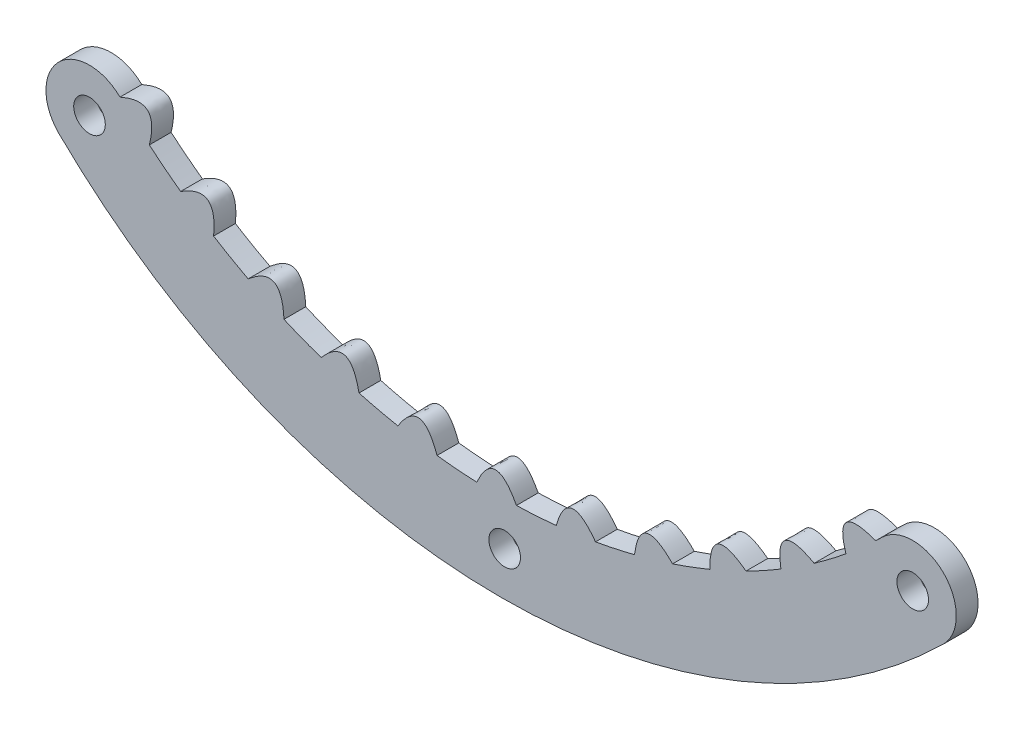
ISO-10303-21;
HEADER;
FILE_DESCRIPTION(('STEP AP214'),'2;1');
FILE_NAME('part.step','',(''),(''),'','','');
FILE_SCHEMA(('AUTOMOTIVE_DESIGN { 1 0 10303 214 1 1 1 1 }'));
ENDSEC;
DATA;
#1=APPLICATION_CONTEXT('core data for automotive mechanical design processes');
#2=APPLICATION_PROTOCOL_DEFINITION('international standard','automotive_design',2000,#1);
#3=PRODUCT_CONTEXT('',#1,'mechanical');
#4=PRODUCT('Part','Part','',(#3));
#5=PRODUCT_RELATED_PRODUCT_CATEGORY('part','',(#4));
#6=PRODUCT_DEFINITION_FORMATION('','',#4);
#7=PRODUCT_DEFINITION_CONTEXT('part definition',#1,'design');
#8=PRODUCT_DEFINITION('design','',#6,#7);
#9=PRODUCT_DEFINITION_SHAPE('','',#8);
#10=(LENGTH_UNIT() NAMED_UNIT(*) SI_UNIT(.MILLI.,.METRE.));
#11=(NAMED_UNIT(*) PLANE_ANGLE_UNIT() SI_UNIT($,.RADIAN.));
#12=(NAMED_UNIT(*) SI_UNIT($,.STERADIAN.) SOLID_ANGLE_UNIT());
#13=UNCERTAINTY_MEASURE_WITH_UNIT(LENGTH_MEASURE(1.E-05),#10,'distance_accuracy_value','');
#14=(GEOMETRIC_REPRESENTATION_CONTEXT(3) GLOBAL_UNCERTAINTY_ASSIGNED_CONTEXT((#13)) GLOBAL_UNIT_ASSIGNED_CONTEXT((#10,
#11,#12)) REPRESENTATION_CONTEXT('',''));
#15=CARTESIAN_POINT('',(0.,0.,0.));
#16=DIRECTION('',(0.,0.,1.));
#17=DIRECTION('',(1.,0.,0.));
#18=AXIS2_PLACEMENT_3D('',#15,#16,#17);
#19=CARTESIAN_POINT('',(0.,0.,2.));
#20=DIRECTION('',(0.,0.,-1.));
#21=DIRECTION('',(-1.,0.,0.));
#22=AXIS2_PLACEMENT_3D('',#19,#20,#21);
#23=CYLINDRICAL_SURFACE('',#22,50.);
#24=CARTESIAN_POINT('',(0.,0.,2.));
#25=DIRECTION('',(0.,0.,1.));
#26=DIRECTION('',(1.,0.,0.));
#27=AXIS2_PLACEMENT_3D('',#24,#25,#26);
#28=CIRCLE('',#27,50.);
#29=CARTESIAN_POINT('',(8.66925415125077,-49.2427053730908,2.));
#30=VERTEX_POINT('',#29);
#31=CARTESIAN_POINT('',(12.2472728629074,-48.4768430018034,2.));
#32=VERTEX_POINT('',#31);
#33=EDGE_CURVE('E228',#30,#32,#28,.T.);
#34=ORIENTED_EDGE('',*,*,#33,.T.);
#35=DIRECTION('',(0.,0.,1.));
#36=VECTOR('',#35,1.);
#37=CARTESIAN_POINT('',(12.2472728629074,-48.4768430018034,0.));
#38=LINE('',#37,#36);
#39=CARTESIAN_POINT('',(12.2472728629074,-48.4768430018034,0.));
#40=VERTEX_POINT('',#39);
#41=EDGE_CURVE('E214',#40,#32,#38,.T.);
#42=ORIENTED_EDGE('',*,*,#41,.F.);
#43=CARTESIAN_POINT('',(0.,0.,0.));
#44=DIRECTION('',(0.,0.,1.));
#45=DIRECTION('',(1.,0.,0.));
#46=AXIS2_PLACEMENT_3D('',#43,#44,#45);
#47=CIRCLE('',#46,50.);
#48=CARTESIAN_POINT('',(8.66925415125077,-49.2427053730908,0.));
#49=VERTEX_POINT('',#48);
#50=EDGE_CURVE('E226',#49,#40,#47,.T.);
#51=ORIENTED_EDGE('',*,*,#50,.F.);
#52=DIRECTION('',(0.,0.,1.));
#53=VECTOR('',#52,1.);
#54=CARTESIAN_POINT('',(8.66925415125077,-49.2427053730908,0.));
#55=LINE('',#54,#53);
#56=EDGE_CURVE('E478',#49,#30,#55,.T.);
#57=ORIENTED_EDGE('',*,*,#56,.T.);
#58=EDGE_LOOP('',(#34,#42,#51,#57));
#59=FACE_BOUND('',#58,.T.);
#60=ADVANCED_FACE('F45',(#59),#23,.F.);
#61=CARTESIAN_POINT('',(15.7466645054504,-47.4556904591303,0.));
#62=VERTEX_POINT('',#61);
#63=CARTESIAN_POINT('',(19.1750431330928,-46.1770258986439,0.));
#64=VERTEX_POINT('',#63);
#65=EDGE_CURVE('E238',#62,#64,#47,.T.);
#66=ORIENTED_EDGE('',*,*,#65,.F.);
#67=DIRECTION('',(0.,0.,1.));
#68=VECTOR('',#67,1.);
#69=CARTESIAN_POINT('',(15.7466645054504,-47.4556904591303,0.));
#70=LINE('',#69,#68);
#71=CARTESIAN_POINT('',(15.7466645054504,-47.4556904591303,2.));
#72=VERTEX_POINT('',#71);
#73=EDGE_CURVE('E61',#62,#72,#70,.T.);
#74=ORIENTED_EDGE('',*,*,#73,.T.);
#75=CARTESIAN_POINT('',(19.1750431330928,-46.1770258986439,2.));
#76=VERTEX_POINT('',#75);
#77=EDGE_CURVE('E275',#72,#76,#28,.T.);
#78=ORIENTED_EDGE('',*,*,#77,.T.);
#79=DIRECTION('',(0.,0.,1.));
#80=VECTOR('',#79,1.);
#81=CARTESIAN_POINT('',(19.1750431330928,-46.1770258986439,0.));
#82=LINE('',#81,#80);
#83=EDGE_CURVE('E351',#64,#76,#82,.T.);
#84=ORIENTED_EDGE('',*,*,#83,.F.);
#85=EDGE_LOOP('',(#66,#74,#78,#84));
#86=FACE_BOUND('',#85,.T.);
#87=ADVANCED_FACE('F337',(#86),#23,.F.);
#88=CARTESIAN_POINT('',(22.4884620442914,-44.6572398932409,0.));
#89=VERTEX_POINT('',#88);
#90=CARTESIAN_POINT('',(25.6941306496517,-42.8930256587085,0.));
#91=VERTEX_POINT('',#90);
#92=EDGE_CURVE('E244',#89,#91,#47,.T.);
#93=ORIENTED_EDGE('',*,*,#92,.F.);
#94=DIRECTION('',(0.,0.,1.));
#95=VECTOR('',#94,1.);
#96=CARTESIAN_POINT('',(22.4884620442914,-44.6572398932409,0.));
#97=LINE('',#96,#95);
#98=CARTESIAN_POINT('',(22.4884620442914,-44.6572398932409,2.));
#99=VERTEX_POINT('',#98);
#100=EDGE_CURVE('E69',#89,#99,#97,.T.);
#101=ORIENTED_EDGE('',*,*,#100,.T.);
#102=CARTESIAN_POINT('',(25.6941306496517,-42.8930256587085,2.));
#103=VERTEX_POINT('',#102);
#104=EDGE_CURVE('E621',#99,#103,#28,.T.);
#105=ORIENTED_EDGE('',*,*,#104,.T.);
#106=DIRECTION('',(0.,0.,1.));
#107=VECTOR('',#106,1.);
#108=CARTESIAN_POINT('',(25.6941306496517,-42.8930256587085,0.));
#109=LINE('',#108,#107);
#110=EDGE_CURVE('E393',#91,#103,#109,.T.);
#111=ORIENTED_EDGE('',*,*,#110,.F.);
#112=EDGE_LOOP('',(#93,#101,#105,#111));
#113=FACE_BOUND('',#112,.T.);
#114=ADVANCED_FACE('F341',(#113),#23,.F.);
#115=CARTESIAN_POINT('',(28.7509570580067,-40.9069977907039,0.));
#116=VERTEX_POINT('',#115);
#117=CARTESIAN_POINT('',(31.6655923802838,-38.6948350455938,0.));
#118=VERTEX_POINT('',#117);
#119=EDGE_CURVE('E249',#116,#118,#47,.T.);
#120=ORIENTED_EDGE('',*,*,#119,.F.);
#121=DIRECTION('',(0.,0.,1.));
#122=VECTOR('',#121,1.);
#123=CARTESIAN_POINT('',(28.7509570580067,-40.9069977907039,0.));
#124=LINE('',#123,#122);
#125=CARTESIAN_POINT('',(28.7509570580067,-40.9069977907039,2.));
#126=VERTEX_POINT('',#125);
#127=EDGE_CURVE('E402',#116,#126,#124,.T.);
#128=ORIENTED_EDGE('',*,*,#127,.T.);
#129=CARTESIAN_POINT('',(31.6655923802838,-38.6948350455938,2.));
#130=VERTEX_POINT('',#129);
#131=EDGE_CURVE('E619',#126,#130,#28,.T.);
#132=ORIENTED_EDGE('',*,*,#131,.T.);
#133=DIRECTION('',(0.,0.,1.));
#134=VECTOR('',#133,1.);
#135=CARTESIAN_POINT('',(31.6655923802838,-38.6948350455938,0.));
#136=LINE('',#135,#134);
#137=EDGE_CURVE('E418',#118,#130,#136,.T.);
#138=ORIENTED_EDGE('',*,*,#137,.F.);
#139=EDGE_LOOP('',(#120,#128,#132,#138));
#140=FACE_BOUND('',#139,.T.);
#141=ADVANCED_FACE('F346',(#140),#23,.F.);
#142=CARTESIAN_POINT('',(34.4006753380109,-36.2848940509514,0.));
#143=VERTEX_POINT('',#142);
#144=CARTESIAN_POINT('',(34.9993996694358,-35.7077305744722,0.));
#145=VERTEX_POINT('',#144);
#146=EDGE_CURVE('E240',#143,#145,#47,.T.);
#147=ORIENTED_EDGE('',*,*,#146,.F.);
#148=DIRECTION('',(0.,0.,1.));
#149=VECTOR('',#148,1.);
#150=CARTESIAN_POINT('',(34.4006753380109,-36.2848940509514,0.));
#151=LINE('',#150,#149);
#152=CARTESIAN_POINT('',(34.4006753380109,-36.2848940509514,2.));
#153=VERTEX_POINT('',#152);
#154=EDGE_CURVE('E426',#143,#153,#151,.T.);
#155=ORIENTED_EDGE('',*,*,#154,.T.);
#156=CARTESIAN_POINT('',(34.9993996694358,-35.7077305744722,2.));
#157=VERTEX_POINT('',#156);
#158=EDGE_CURVE('E279',#153,#157,#28,.T.);
#159=ORIENTED_EDGE('',*,*,#158,.T.);
#160=DIRECTION('',(0.,0.,-1.));
#161=VECTOR('',#160,1.);
#162=CARTESIAN_POINT('',(34.9993996694358,-35.7077305744722,2.));
#163=LINE('',#162,#161);
#164=EDGE_CURVE('E11',#157,#145,#163,.T.);
#165=ORIENTED_EDGE('',*,*,#164,.T.);
#166=EDGE_LOOP('',(#147,#155,#159,#165));
#167=FACE_BOUND('',#166,.T.);
#168=ADVANCED_FACE('F638',(#167),#23,.F.);
#169=CARTESIAN_POINT('',(1.40707369594471,-49.9801975147576,2.));
#170=VERTEX_POINT('',#169);
#171=CARTESIAN_POINT('',(5.05847323475464,-49.743460359461,2.));
#172=VERTEX_POINT('',#171);
#173=EDGE_CURVE('E623',#170,#172,#28,.T.);
#174=ORIENTED_EDGE('',*,*,#173,.T.);
#175=DIRECTION('',(0.,0.,1.));
#176=VECTOR('',#175,1.);
#177=CARTESIAN_POINT('',(5.05847323475464,-49.743460359461,0.));
#178=LINE('',#177,#176);
#179=CARTESIAN_POINT('',(5.05847323475464,-49.743460359461,0.));
#180=VERTEX_POINT('',#179);
#181=EDGE_CURVE('E442',#180,#172,#178,.T.);
#182=ORIENTED_EDGE('',*,*,#181,.F.);
#183=CARTESIAN_POINT('',(1.40707369594471,-49.9801975147576,0.));
#184=VERTEX_POINT('',#183);
#185=EDGE_CURVE('E237',#184,#180,#47,.T.);
#186=ORIENTED_EDGE('',*,*,#185,.F.);
#187=DIRECTION('',(0.,0.,1.));
#188=VECTOR('',#187,1.);
#189=CARTESIAN_POINT('',(1.40707369594471,-49.9801975147576,0.));
#190=LINE('',#189,#188);
#191=EDGE_CURVE('E479',#184,#170,#190,.T.);
#192=ORIENTED_EDGE('',*,*,#191,.T.);
#193=EDGE_LOOP('',(#174,#182,#186,#192));
#194=FACE_BOUND('',#193,.T.);
#195=ADVANCED_FACE('F640',(#194),#23,.F.);
#196=CARTESIAN_POINT('',(-5.88509609229904,-49.6524485195283,2.));
#197=VERTEX_POINT('',#196);
#198=CARTESIAN_POINT('',(-2.23813896812753,-49.9498822216765,2.));
#199=VERTEX_POINT('',#198);
#200=EDGE_CURVE('E627',#197,#199,#28,.T.);
#201=ORIENTED_EDGE('',*,*,#200,.T.);
#202=DIRECTION('',(0.,0.,1.));
#203=VECTOR('',#202,1.);
#204=CARTESIAN_POINT('',(-2.23813896812753,-49.9498822216765,0.));
#205=LINE('',#204,#203);
#206=CARTESIAN_POINT('',(-2.23813896812753,-49.9498822216765,0.));
#207=VERTEX_POINT('',#206);
#208=EDGE_CURVE('E469',#207,#199,#205,.T.);
#209=ORIENTED_EDGE('',*,*,#208,.F.);
#210=CARTESIAN_POINT('',(-5.88509609229904,-49.6524485195283,0.));
#211=VERTEX_POINT('',#210);
#212=EDGE_CURVE('E243',#211,#207,#47,.T.);
#213=ORIENTED_EDGE('',*,*,#212,.F.);
#214=DIRECTION('',(0.,0.,1.));
#215=VECTOR('',#214,1.);
#216=CARTESIAN_POINT('',(-5.88509609229904,-49.6524485195283,0.));
#217=LINE('',#216,#215);
#218=EDGE_CURVE('E503',#211,#197,#217,.T.);
#219=ORIENTED_EDGE('',*,*,#218,.T.);
#220=EDGE_LOOP('',(#201,#209,#213,#219));
#221=FACE_BOUND('',#220,.T.);
#222=ADVANCED_FACE('F645',(#221),#23,.F.);
#223=CARTESIAN_POINT('',(-13.0518352747464,-48.2664437882147,2.));
#224=VERTEX_POINT('',#223);
#225=CARTESIAN_POINT('',(-9.48704912464949,-49.0917090648359,2.));
#226=VERTEX_POINT('',#225);
#227=EDGE_CURVE('E906',#224,#226,#28,.T.);
#228=ORIENTED_EDGE('',*,*,#227,.T.);
#229=DIRECTION('',(0.,0.,1.));
#230=VECTOR('',#229,1.);
#231=CARTESIAN_POINT('',(-9.48704912464949,-49.0917090648359,0.));
#232=LINE('',#231,#230);
#233=CARTESIAN_POINT('',(-9.48704912464949,-49.0917090648359,0.));
#234=VERTEX_POINT('',#233);
#235=EDGE_CURVE('E495',#234,#226,#232,.T.);
#236=ORIENTED_EDGE('',*,*,#235,.F.);
#237=CARTESIAN_POINT('',(-13.0518352747464,-48.2664437882147,0.));
#238=VERTEX_POINT('',#237);
#239=EDGE_CURVE('E888',#238,#234,#47,.T.);
#240=ORIENTED_EDGE('',*,*,#239,.F.);
#241=DIRECTION('',(0.,0.,1.));
#242=VECTOR('',#241,1.);
#243=CARTESIAN_POINT('',(-13.0518352747464,-48.2664437882147,0.));
#244=LINE('',#243,#242);
#245=EDGE_CURVE('E551',#238,#224,#244,.T.);
#246=ORIENTED_EDGE('',*,*,#245,.T.);
#247=EDGE_LOOP('',(#228,#236,#240,#246));
#248=FACE_BOUND('',#247,.T.);
#249=ADVANCED_FACE('F917',(#248),#23,.F.);
#250=CARTESIAN_POINT('',(-19.9403972482591,-45.8517236053523,2.));
#251=VERTEX_POINT('',#250);
#252=CARTESIAN_POINT('',(-16.533759300022,-47.1872313598598,2.));
#253=VERTEX_POINT('',#252);
#254=EDGE_CURVE('E901',#251,#253,#28,.T.);
#255=ORIENTED_EDGE('',*,*,#254,.T.);
#256=DIRECTION('',(0.,0.,1.));
#257=VECTOR('',#256,1.);
#258=CARTESIAN_POINT('',(-16.533759300022,-47.1872313598598,0.));
#259=LINE('',#258,#257);
#260=CARTESIAN_POINT('',(-16.533759300022,-47.1872313598598,0.));
#261=VERTEX_POINT('',#260);
#262=EDGE_CURVE('E520',#261,#253,#259,.T.);
#263=ORIENTED_EDGE('',*,*,#262,.F.);
#264=CARTESIAN_POINT('',(-19.9403972482591,-45.8517236053523,0.));
#265=VERTEX_POINT('',#264);
#266=EDGE_CURVE('E890',#265,#261,#47,.T.);
#267=ORIENTED_EDGE('',*,*,#266,.F.);
#268=DIRECTION('',(0.,0.,1.));
#269=VECTOR('',#268,1.);
#270=CARTESIAN_POINT('',(-19.9403972482591,-45.8517236053523,0.));
#271=LINE('',#270,#269);
#272=EDGE_CURVE('E552',#265,#251,#271,.T.);
#273=ORIENTED_EDGE('',*,*,#272,.T.);
#274=EDGE_LOOP('',(#255,#263,#267,#273));
#275=FACE_BOUND('',#274,.T.);
#276=ADVANCED_FACE('F334',(#275),#23,.F.);
#277=CARTESIAN_POINT('',(-26.4039642739504,-42.4597535393218,2.));
#278=VERTEX_POINT('',#277);
#279=CARTESIAN_POINT('',(-23.2280811010044,-44.2770397425705,2.));
#280=VERTEX_POINT('',#279);
#281=EDGE_CURVE('E274',#278,#280,#28,.T.);
#282=ORIENTED_EDGE('',*,*,#281,.T.);
#283=DIRECTION('',(0.,0.,1.));
#284=VECTOR('',#283,1.);
#285=CARTESIAN_POINT('',(-23.2280811010044,-44.2770397425705,0.));
#286=LINE('',#285,#284);
#287=CARTESIAN_POINT('',(-23.2280811010044,-44.2770397425705,0.));
#288=VERTEX_POINT('',#287);
#289=EDGE_CURVE('E542',#288,#280,#286,.T.);
#290=ORIENTED_EDGE('',*,*,#289,.F.);
#291=CARTESIAN_POINT('',(-26.4039642739504,-42.4597535393218,0.));
#292=VERTEX_POINT('',#291);
#293=EDGE_CURVE('E603',#292,#288,#47,.T.);
#294=ORIENTED_EDGE('',*,*,#293,.F.);
#295=DIRECTION('',(0.,0.,1.));
#296=VECTOR('',#295,1.);
#297=CARTESIAN_POINT('',(-26.4039642739504,-42.4597535393218,0.));
#298=LINE('',#297,#296);
#299=EDGE_CURVE('E287',#292,#278,#298,.T.);
#300=ORIENTED_EDGE('',*,*,#299,.T.);
#301=EDGE_LOOP('',(#282,#290,#294,#300));
#302=FACE_BOUND('',#301,.T.);
#303=ADVANCED_FACE('F327',(#302),#23,.F.);
#304=CARTESIAN_POINT('',(-32.3047766423902,-38.1628275431117,2.));
#305=VERTEX_POINT('',#304);
#306=CARTESIAN_POINT('',(-29.427336680757,-40.4231598947605,2.));
#307=VERTEX_POINT('',#306);
#308=EDGE_CURVE('E270',#305,#307,#28,.T.);
#309=ORIENTED_EDGE('',*,*,#308,.T.);
#310=DIRECTION('',(0.,0.,1.));
#311=VECTOR('',#310,1.);
#312=CARTESIAN_POINT('',(-29.427336680757,-40.4231598947605,0.));
#313=LINE('',#312,#311);
#314=CARTESIAN_POINT('',(-29.427336680757,-40.4231598947605,0.));
#315=VERTEX_POINT('',#314);
#316=EDGE_CURVE('E297',#315,#307,#313,.T.);
#317=ORIENTED_EDGE('',*,*,#316,.F.);
#318=CARTESIAN_POINT('',(-32.3047766423902,-38.1628275431117,0.));
#319=VERTEX_POINT('',#318);
#320=EDGE_CURVE('E245',#319,#315,#47,.T.);
#321=ORIENTED_EDGE('',*,*,#320,.F.);
#322=DIRECTION('',(0.,0.,1.));
#323=VECTOR('',#322,1.);
#324=CARTESIAN_POINT('',(-32.3047766423902,-38.1628275431117,0.));
#325=LINE('',#324,#323);
#326=EDGE_CURVE('E255',#319,#305,#325,.T.);
#327=ORIENTED_EDGE('',*,*,#326,.T.);
#328=EDGE_LOOP('',(#309,#317,#321,#327));
#329=FACE_BOUND('',#328,.T.);
#330=ADVANCED_FACE('F325',(#329),#23,.F.);
#331=CARTESIAN_POINT('',(37.7993516429907,-38.56434902043,2.));
#332=DIRECTION('',(0.,0.,-1.));
#333=DIRECTION('',(-1.,0.,0.));
#334=AXIS2_PLACEMENT_3D('',#331,#332,#333);
#335=CYLINDRICAL_SURFACE('',#334,4.);
#336=CARTESIAN_POINT('',(37.7993516429907,-38.56434902043,0.));
#337=DIRECTION('',(0.,0.,1.));
#338=DIRECTION('',(1.,0.,0.));
#339=AXIS2_PLACEMENT_3D('',#336,#337,#338);
#340=CIRCLE('',#339,4.);
#341=CARTESIAN_POINT('',(40.5993036165455,-41.4209674663878,0.));
#342=VERTEX_POINT('',#341);
#343=EDGE_CURVE('E250',#145,#342,#340,.F.);
#344=ORIENTED_EDGE('',*,*,#343,.F.);
#345=ORIENTED_EDGE('',*,*,#164,.F.);
#346=CARTESIAN_POINT('',(37.7993516429907,-38.56434902043,2.));
#347=DIRECTION('',(0.,0.,1.));
#348=DIRECTION('',(1.,0.,0.));
#349=AXIS2_PLACEMENT_3D('',#346,#347,#348);
#350=CIRCLE('',#349,4.);
#351=CARTESIAN_POINT('',(40.5993036165455,-41.4209674663878,2.));
#352=VERTEX_POINT('',#351);
#353=EDGE_CURVE('E276',#157,#352,#350,.F.);
#354=ORIENTED_EDGE('',*,*,#353,.T.);
#355=DIRECTION('',(0.,0.,-1.));
#356=VECTOR('',#355,1.);
#357=CARTESIAN_POINT('',(40.5993036165455,-41.4209674663878,2.));
#358=LINE('',#357,#356);
#359=EDGE_CURVE('E266',#352,#342,#358,.T.);
#360=ORIENTED_EDGE('',*,*,#359,.T.);
#361=EDGE_LOOP('',(#344,#345,#354,#360));
#362=FACE_BOUND('',#361,.T.);
#363=ADVANCED_FACE('F47',(#362),#335,.T.);
#364=CARTESIAN_POINT('',(-37.7993516429907,-38.56434902043,2.));
#365=DIRECTION('',(0.,0.,-1.));
#366=DIRECTION('',(-1.,0.,0.));
#367=AXIS2_PLACEMENT_3D('',#364,#365,#366);
#368=CYLINDRICAL_SURFACE('',#367,4.);
#369=CARTESIAN_POINT('',(-37.7993516429907,-38.56434902043,0.));
#370=DIRECTION('',(0.,0.,1.));
#371=DIRECTION('',(1.,0.,0.));
#372=AXIS2_PLACEMENT_3D('',#369,#370,#371);
#373=CIRCLE('',#372,4.);
#374=CARTESIAN_POINT('',(-34.9993996694358,-35.7077305744722,0.));
#375=VERTEX_POINT('',#374);
#376=CARTESIAN_POINT('',(-40.5993036165455,-41.4209674663878,0.));
#377=VERTEX_POINT('',#376);
#378=EDGE_CURVE('E595',#375,#377,#373,.T.);
#379=ORIENTED_EDGE('',*,*,#378,.T.);
#380=DIRECTION('',(0.,0.,-1.));
#381=VECTOR('',#380,1.);
#382=CARTESIAN_POINT('',(-40.5993036165455,-41.4209674663878,2.));
#383=LINE('',#382,#381);
#384=CARTESIAN_POINT('',(-40.5993036165455,-41.4209674663878,2.));
#385=VERTEX_POINT('',#384);
#386=EDGE_CURVE('E607',#385,#377,#383,.T.);
#387=ORIENTED_EDGE('',*,*,#386,.F.);
#388=CARTESIAN_POINT('',(-37.7993516429907,-38.56434902043,2.));
#389=DIRECTION('',(0.,0.,1.));
#390=DIRECTION('',(1.,0.,0.));
#391=AXIS2_PLACEMENT_3D('',#388,#389,#390);
#392=CIRCLE('',#391,4.);
#393=CARTESIAN_POINT('',(-34.9993996694358,-35.7077305744722,2.));
#394=VERTEX_POINT('',#393);
#395=EDGE_CURVE('E267',#394,#385,#392,.T.);
#396=ORIENTED_EDGE('',*,*,#395,.F.);
#397=DIRECTION('',(0.,0.,-1.));
#398=VECTOR('',#397,1.);
#399=CARTESIAN_POINT('',(-34.9993996694358,-35.7077305744722,2.));
#400=LINE('',#399,#398);
#401=EDGE_CURVE('E54',#394,#375,#400,.T.);
#402=ORIENTED_EDGE('',*,*,#401,.T.);
#403=EDGE_LOOP('',(#379,#387,#396,#402));
#404=FACE_BOUND('',#403,.T.);
#405=ADVANCED_FACE('F321',(#404),#368,.T.);
#406=CARTESIAN_POINT('',(0.,0.,2.));
#407=DIRECTION('',(0.,0.,-1.));
#408=DIRECTION('',(-1.,0.,0.));
#409=AXIS2_PLACEMENT_3D('',#406,#407,#408);
#410=CYLINDRICAL_SURFACE('',#409,58.);
#411=CARTESIAN_POINT('',(0.,0.,0.));
#412=DIRECTION('',(0.,0.,1.));
#413=DIRECTION('',(1.,0.,0.));
#414=AXIS2_PLACEMENT_3D('',#411,#412,#413);
#415=CIRCLE('',#414,58.);
#416=EDGE_CURVE('E280',#377,#342,#415,.T.);
#417=ORIENTED_EDGE('',*,*,#416,.T.);
#418=ORIENTED_EDGE('',*,*,#359,.F.);
#419=CARTESIAN_POINT('',(0.,0.,2.));
#420=DIRECTION('',(0.,0.,1.));
#421=DIRECTION('',(1.,0.,0.));
#422=AXIS2_PLACEMENT_3D('',#419,#420,#421);
#423=CIRCLE('',#422,58.);
#424=EDGE_CURVE('E263',#385,#352,#423,.T.);
#425=ORIENTED_EDGE('',*,*,#424,.F.);
#426=ORIENTED_EDGE('',*,*,#386,.T.);
#427=EDGE_LOOP('',(#417,#418,#425,#426));
#428=FACE_BOUND('',#427,.T.);
#429=ADVANCED_FACE('F314',(#428),#410,.T.);
#430=CARTESIAN_POINT('',(0.,0.,2.));
#431=DIRECTION('',(0.,0.,1.));
#432=DIRECTION('',(1.,0.,0.));
#433=AXIS2_PLACEMENT_3D('',#430,#431,#432);
#434=PLANE('',#433);
#435=CARTESIAN_POINT('',(-37.7993516429907,-38.56434902043,2.));
#436=DIRECTION('',(0.,0.,1.));
#437=DIRECTION('',(1.,0.,0.));
#438=AXIS2_PLACEMENT_3D('',#435,#436,#437);
#439=CIRCLE('',#438,1.45);
#440=CARTESIAN_POINT('',(-36.3493516429906,-38.56434902043,2.));
#441=VERTEX_POINT('',#440);
#442=EDGE_CURVE('E841',#441,#441,#439,.T.);
#443=ORIENTED_EDGE('',*,*,#442,.F.);
#444=EDGE_LOOP('',(#443));
#445=FACE_BOUND('',#444,.T.);
#446=CARTESIAN_POINT('',(0.328913230522185,-53.956500006483,2.));
#447=DIRECTION('',(0.,0.,1.));
#448=DIRECTION('',(1.,0.,0.));
#449=AXIS2_PLACEMENT_3D('',#446,#447,#448);
#450=CIRCLE('',#449,1.45);
#451=CARTESIAN_POINT('',(1.77891323052218,-53.956500006483,2.));
#452=VERTEX_POINT('',#451);
#453=EDGE_CURVE('E849',#452,#452,#450,.T.);
#454=ORIENTED_EDGE('',*,*,#453,.F.);
#455=EDGE_LOOP('',(#454));
#456=FACE_BOUND('',#455,.T.);
#457=CARTESIAN_POINT('',(37.7993516429907,-38.56434902043,2.));
#458=DIRECTION('',(0.,0.,1.));
#459=DIRECTION('',(1.,0.,0.));
#460=AXIS2_PLACEMENT_3D('',#457,#458,#459);
#461=CIRCLE('',#460,1.45);
#462=CARTESIAN_POINT('',(39.2493516429907,-38.56434902043,2.));
#463=VERTEX_POINT('',#462);
#464=EDGE_CURVE('E859',#463,#463,#461,.T.);
#465=ORIENTED_EDGE('',*,*,#464,.F.);
#466=EDGE_LOOP('',(#465));
#467=FACE_BOUND('',#466,.T.);
#468=ORIENTED_EDGE('',*,*,#353,.F.);
#469=ORIENTED_EDGE('',*,*,#158,.F.);
#470=CARTESIAN_POINT('',(31.6655923802838,-38.6948350455938,2.));
#471=CARTESIAN_POINT('',(30.4246373189055,-34.829559416698,2.));
#472=CARTESIAN_POINT('',(34.4006753380109,-36.2848940509514,2.));
#473=B_SPLINE_CURVE_WITH_KNOTS('',2,(#470,#471,#472),.UNSPECIFIED.,.F.,.F.,(3,3),(0.,1.),.UNSPECIFIED.);
#474=EDGE_CURVE('E409',#130,#153,#473,.T.);
#475=ORIENTED_EDGE('',*,*,#474,.F.);
#476=ORIENTED_EDGE('',*,*,#131,.F.);
#477=CARTESIAN_POINT('',(25.6941306496517,-42.8930256587085,2.));
#478=CARTESIAN_POINT('',(25.0291886347827,-38.8882563434349,2.));
#479=CARTESIAN_POINT('',(28.7509570580067,-40.9069977907039,2.));
#480=B_SPLINE_CURVE_WITH_KNOTS('',2,(#477,#478,#479),.UNSPECIFIED.,.F.,.F.,(3,3),(0.,1.),.UNSPECIFIED.);
#481=EDGE_CURVE('E394',#103,#126,#480,.T.);
#482=ORIENTED_EDGE('',*,*,#481,.F.);
#483=ORIENTED_EDGE('',*,*,#104,.F.);
#484=CARTESIAN_POINT('',(19.1750431330928,-46.1770258986439,2.));
#485=CARTESIAN_POINT('',(19.1002862493409,-42.1181176020662,2.));
#486=CARTESIAN_POINT('',(22.4884620442914,-44.6572398932409,2.));
#487=B_SPLINE_CURVE_WITH_KNOTS('',2,(#484,#485,#486),.UNSPECIFIED.,.F.,.F.,(3,3),(0.,1.),.UNSPECIFIED.);
#488=EDGE_CURVE('E357',#76,#99,#487,.T.);
#489=ORIENTED_EDGE('',*,*,#488,.F.);
#490=ORIENTED_EDGE('',*,*,#77,.F.);
#491=CARTESIAN_POINT('',(12.2472728629074,-48.4768430018033,2.));
#492=CARTESIAN_POINT('',(12.7642944234605,-44.4503043073886,2.));
#493=CARTESIAN_POINT('',(15.7466645054504,-47.4556904591303,2.));
#494=B_SPLINE_CURVE_WITH_KNOTS('',2,(#491,#492,#493),.UNSPECIFIED.,.F.,.F.,(3,3),(0.,1.),.UNSPECIFIED.);
#495=EDGE_CURVE('E220',#32,#72,#494,.T.);
#496=ORIENTED_EDGE('',*,*,#495,.F.);
#497=ORIENTED_EDGE('',*,*,#33,.F.);
#498=CARTESIAN_POINT('',(5.05847323475464,-49.743460359461,2.));
#499=CARTESIAN_POINT('',(6.15625382267664,-45.8351099488048,2.));
#500=CARTESIAN_POINT('',(8.66925415125077,-49.2427053730908,2.));
#501=B_SPLINE_CURVE_WITH_KNOTS('',2,(#498,#499,#500),.UNSPECIFIED.,.F.,.F.,(3,3),(0.,1.),.UNSPECIFIED.);
#502=EDGE_CURVE('E433',#172,#30,#501,.T.);
#503=ORIENTED_EDGE('',*,*,#502,.F.);
#504=ORIENTED_EDGE('',*,*,#173,.F.);
#505=CARTESIAN_POINT('',(-2.23813896812753,-49.9498822216764,2.));
#506=CARTESIAN_POINT('',(-0.582996640156172,-46.2430197982983,2.));
#507=CARTESIAN_POINT('',(1.40707369594471,-49.9801975147576,2.));
#508=B_SPLINE_CURVE_WITH_KNOTS('',2,(#505,#506,#507),.UNSPECIFIED.,.F.,.F.,(3,3),(0.,1.),.UNSPECIFIED.);
#509=EDGE_CURVE('E470',#199,#170,#508,.T.);
#510=ORIENTED_EDGE('',*,*,#509,.F.);
#511=ORIENTED_EDGE('',*,*,#200,.F.);
#512=CARTESIAN_POINT('',(-9.48704912464949,-49.0917090648359,2.));
#513=CARTESIAN_POINT('',(-7.30982154177376,-45.6653399656201,2.));
#514=CARTESIAN_POINT('',(-5.88509609229904,-49.6524485195283,2.));
#515=B_SPLINE_CURVE_WITH_KNOTS('',2,(#512,#513,#514),.UNSPECIFIED.,.F.,.F.,(3,3),(0.,1.),.UNSPECIFIED.);
#516=EDGE_CURVE('E486',#226,#197,#515,.T.);
#517=ORIENTED_EDGE('',*,*,#516,.F.);
#518=ORIENTED_EDGE('',*,*,#227,.F.);
#519=CARTESIAN_POINT('',(-16.533759300022,-47.1872313598598,2.));
#520=CARTESIAN_POINT('',(-13.8808502881767,-44.1143826934648,2.));
#521=CARTESIAN_POINT('',(-13.0518352747464,-48.2664437882147,2.));
#522=B_SPLINE_CURVE_WITH_KNOTS('',2,(#519,#520,#521),.UNSPECIFIED.,.F.,.F.,(3,3),(0.,1.),.UNSPECIFIED.);
#523=EDGE_CURVE('E510',#253,#224,#522,.T.);
#524=ORIENTED_EDGE('',*,*,#523,.F.);
#525=ORIENTED_EDGE('',*,*,#254,.F.);
#526=CARTESIAN_POINT('',(-23.2280811010044,-44.2770397425705,2.));
#527=CARTESIAN_POINT('',(-20.1560328099285,-41.6232039433935,2.));
#528=CARTESIAN_POINT('',(-19.9403972482591,-45.8517236053523,2.));
#529=B_SPLINE_CURVE_WITH_KNOTS('',2,(#526,#527,#528),.UNSPECIFIED.,.F.,.F.,(3,3),(0.,1.),.UNSPECIFIED.);
#530=EDGE_CURVE('E543',#280,#251,#529,.T.);
#531=ORIENTED_EDGE('',*,*,#530,.F.);
#532=ORIENTED_EDGE('',*,*,#281,.F.);
#533=CARTESIAN_POINT('',(-29.427336680757,-40.4231598947605,2.));
#534=CARTESIAN_POINT('',(-26.0016244862374,-38.2448988654034,2.));
#535=CARTESIAN_POINT('',(-26.4039642739504,-42.4597535393218,2.));
#536=B_SPLINE_CURVE_WITH_KNOTS('',2,(#533,#534,#535),.UNSPECIFIED.,.F.,.F.,(3,3),(0.,1.),.UNSPECIFIED.);
#537=EDGE_CURVE('E559',#307,#278,#536,.T.);
#538=ORIENTED_EDGE('',*,*,#537,.F.);
#539=ORIENTED_EDGE('',*,*,#308,.F.);
#540=CARTESIAN_POINT('',(-34.9993996694358,-35.7077305744722,2.));
#541=CARTESIAN_POINT('',(-31.2930366793479,-34.0514701669874,2.));
#542=CARTESIAN_POINT('',(-32.3047766423901,-38.1628275431117,2.));
#543=B_SPLINE_CURVE_WITH_KNOTS('',2,(#540,#541,#542),.UNSPECIFIED.,.F.,.F.,(3,3),(0.,1.),.UNSPECIFIED.);
#544=EDGE_CURVE('E282',#394,#305,#543,.T.);
#545=ORIENTED_EDGE('',*,*,#544,.F.);
#546=ORIENTED_EDGE('',*,*,#395,.T.);
#547=ORIENTED_EDGE('',*,*,#424,.T.);
#548=EDGE_LOOP('',(#468,#469,#475,#476,#482,#483,#489,#490,#496,#497,#503,#504,#510,#511,#517,
#518,#524,#525,#531,#532,#538,#539,#545,#546,#547));
#549=FACE_BOUND('',#548,.T.);
#550=ADVANCED_FACE('F311',(#445,#456,#467,#549),#434,.T.);
#551=CARTESIAN_POINT('',(0.,0.,0.));
#552=DIRECTION('',(0.,0.,1.));
#553=DIRECTION('',(1.,0.,0.));
#554=AXIS2_PLACEMENT_3D('',#551,#552,#553);
#555=PLANE('',#554);
#556=CARTESIAN_POINT('',(-37.7993516429907,-38.56434902043,0.));
#557=DIRECTION('',(0.,0.,1.));
#558=DIRECTION('',(1.,0.,0.));
#559=AXIS2_PLACEMENT_3D('',#556,#557,#558);
#560=CIRCLE('',#559,1.45);
#561=CARTESIAN_POINT('',(-36.3493516429906,-38.56434902043,0.));
#562=VERTEX_POINT('',#561);
#563=EDGE_CURVE('E838',#562,#562,#560,.T.);
#564=ORIENTED_EDGE('',*,*,#563,.T.);
#565=EDGE_LOOP('',(#564));
#566=FACE_BOUND('',#565,.T.);
#567=CARTESIAN_POINT('',(0.328913230522185,-53.956500006483,0.));
#568=DIRECTION('',(0.,0.,1.));
#569=DIRECTION('',(1.,0.,0.));
#570=AXIS2_PLACEMENT_3D('',#567,#568,#569);
#571=CIRCLE('',#570,1.45);
#572=CARTESIAN_POINT('',(1.77891323052218,-53.956500006483,0.));
#573=VERTEX_POINT('',#572);
#574=EDGE_CURVE('E843',#573,#573,#571,.T.);
#575=ORIENTED_EDGE('',*,*,#574,.T.);
#576=EDGE_LOOP('',(#575));
#577=FACE_BOUND('',#576,.T.);
#578=CARTESIAN_POINT('',(37.7993516429907,-38.56434902043,0.));
#579=DIRECTION('',(0.,0.,1.));
#580=DIRECTION('',(1.,0.,0.));
#581=AXIS2_PLACEMENT_3D('',#578,#579,#580);
#582=CIRCLE('',#581,1.45);
#583=CARTESIAN_POINT('',(39.2493516429907,-38.56434902043,0.));
#584=VERTEX_POINT('',#583);
#585=EDGE_CURVE('E855',#584,#584,#582,.T.);
#586=ORIENTED_EDGE('',*,*,#585,.T.);
#587=EDGE_LOOP('',(#586));
#588=FACE_BOUND('',#587,.T.);
#589=ORIENTED_EDGE('',*,*,#343,.T.);
#590=ORIENTED_EDGE('',*,*,#416,.F.);
#591=ORIENTED_EDGE('',*,*,#378,.F.);
#592=CARTESIAN_POINT('',(-34.9993996694358,-35.7077305744722,0.));
#593=CARTESIAN_POINT('',(-31.2930366793479,-34.0514701669874,0.));
#594=CARTESIAN_POINT('',(-32.3047766423901,-38.1628275431117,0.));
#595=B_SPLINE_CURVE_WITH_KNOTS('',2,(#592,#593,#594),.UNSPECIFIED.,.F.,.F.,(3,3),(0.,1.),.UNSPECIFIED.);
#596=EDGE_CURVE('E260',#375,#319,#595,.T.);
#597=ORIENTED_EDGE('',*,*,#596,.T.);
#598=ORIENTED_EDGE('',*,*,#320,.T.);
#599=CARTESIAN_POINT('',(-29.427336680757,-40.4231598947605,0.));
#600=CARTESIAN_POINT('',(-26.0016244862374,-38.2448988654034,0.));
#601=CARTESIAN_POINT('',(-26.4039642739504,-42.4597535393218,0.));
#602=B_SPLINE_CURVE_WITH_KNOTS('',2,(#599,#600,#601),.UNSPECIFIED.,.F.,.F.,(3,3),(0.,1.),.UNSPECIFIED.);
#603=EDGE_CURVE('E561',#315,#292,#602,.T.);
#604=ORIENTED_EDGE('',*,*,#603,.T.);
#605=ORIENTED_EDGE('',*,*,#293,.T.);
#606=CARTESIAN_POINT('',(-23.2280811010044,-44.2770397425705,0.));
#607=CARTESIAN_POINT('',(-20.1560328099285,-41.6232039433935,0.));
#608=CARTESIAN_POINT('',(-19.9403972482591,-45.8517236053523,0.));
#609=B_SPLINE_CURVE_WITH_KNOTS('',2,(#606,#607,#608),.UNSPECIFIED.,.F.,.F.,(3,3),(0.,1.),.UNSPECIFIED.);
#610=EDGE_CURVE('E534',#288,#265,#609,.T.);
#611=ORIENTED_EDGE('',*,*,#610,.T.);
#612=ORIENTED_EDGE('',*,*,#266,.T.);
#613=CARTESIAN_POINT('',(-16.533759300022,-47.1872313598598,0.));
#614=CARTESIAN_POINT('',(-13.8808502881767,-44.1143826934648,0.));
#615=CARTESIAN_POINT('',(-13.0518352747464,-48.2664437882147,0.));
#616=B_SPLINE_CURVE_WITH_KNOTS('',2,(#613,#614,#615),.UNSPECIFIED.,.F.,.F.,(3,3),(0.,1.),.UNSPECIFIED.);
#617=EDGE_CURVE('E513',#261,#238,#616,.T.);
#618=ORIENTED_EDGE('',*,*,#617,.T.);
#619=ORIENTED_EDGE('',*,*,#239,.T.);
#620=CARTESIAN_POINT('',(-9.48704912464949,-49.0917090648359,0.));
#621=CARTESIAN_POINT('',(-7.30982154177376,-45.6653399656201,0.));
#622=CARTESIAN_POINT('',(-5.88509609229904,-49.6524485195283,0.));
#623=B_SPLINE_CURVE_WITH_KNOTS('',2,(#620,#621,#622),.UNSPECIFIED.,.F.,.F.,(3,3),(0.,1.),.UNSPECIFIED.);
#624=EDGE_CURVE('E488',#234,#211,#623,.T.);
#625=ORIENTED_EDGE('',*,*,#624,.T.);
#626=ORIENTED_EDGE('',*,*,#212,.T.);
#627=CARTESIAN_POINT('',(-2.23813896812753,-49.9498822216764,0.));
#628=CARTESIAN_POINT('',(-0.582996640156172,-46.2430197982983,0.));
#629=CARTESIAN_POINT('',(1.40707369594471,-49.9801975147576,0.));
#630=B_SPLINE_CURVE_WITH_KNOTS('',2,(#627,#628,#629),.UNSPECIFIED.,.F.,.F.,(3,3),(0.,1.),.UNSPECIFIED.);
#631=EDGE_CURVE('E461',#207,#184,#630,.T.);
#632=ORIENTED_EDGE('',*,*,#631,.T.);
#633=ORIENTED_EDGE('',*,*,#185,.T.);
#634=CARTESIAN_POINT('',(5.05847323475464,-49.743460359461,0.));
#635=CARTESIAN_POINT('',(6.15625382267664,-45.8351099488048,0.));
#636=CARTESIAN_POINT('',(8.66925415125077,-49.2427053730908,0.));
#637=B_SPLINE_CURVE_WITH_KNOTS('',2,(#634,#635,#636),.UNSPECIFIED.,.F.,.F.,(3,3),(0.,1.),.UNSPECIFIED.);
#638=EDGE_CURVE('E235',#180,#49,#637,.T.);
#639=ORIENTED_EDGE('',*,*,#638,.T.);
#640=ORIENTED_EDGE('',*,*,#50,.T.);
#641=CARTESIAN_POINT('',(12.2472728629074,-48.4768430018033,0.));
#642=CARTESIAN_POINT('',(12.7642944234605,-44.4503043073886,0.));
#643=CARTESIAN_POINT('',(15.7466645054504,-47.4556904591303,0.));
#644=B_SPLINE_CURVE_WITH_KNOTS('',2,(#641,#642,#643),.UNSPECIFIED.,.F.,.F.,(3,3),(0.,1.),.UNSPECIFIED.);
#645=EDGE_CURVE('E211',#40,#62,#644,.T.);
#646=ORIENTED_EDGE('',*,*,#645,.T.);
#647=ORIENTED_EDGE('',*,*,#65,.T.);
#648=CARTESIAN_POINT('',(19.1750431330928,-46.1770258986439,0.));
#649=CARTESIAN_POINT('',(19.1002862493409,-42.1181176020662,0.));
#650=CARTESIAN_POINT('',(22.4884620442914,-44.6572398932409,0.));
#651=B_SPLINE_CURVE_WITH_KNOTS('',2,(#648,#649,#650),.UNSPECIFIED.,.F.,.F.,(3,3),(0.,1.),.UNSPECIFIED.);
#652=EDGE_CURVE('E352',#64,#89,#651,.T.);
#653=ORIENTED_EDGE('',*,*,#652,.T.);
#654=ORIENTED_EDGE('',*,*,#92,.T.);
#655=CARTESIAN_POINT('',(25.6941306496517,-42.8930256587085,0.));
#656=CARTESIAN_POINT('',(25.0291886347827,-38.8882563434349,0.));
#657=CARTESIAN_POINT('',(28.7509570580067,-40.9069977907039,0.));
#658=B_SPLINE_CURVE_WITH_KNOTS('',2,(#655,#656,#657),.UNSPECIFIED.,.F.,.F.,(3,3),(0.,1.),.UNSPECIFIED.);
#659=EDGE_CURVE('E386',#91,#116,#658,.T.);
#660=ORIENTED_EDGE('',*,*,#659,.T.);
#661=ORIENTED_EDGE('',*,*,#119,.T.);
#662=CARTESIAN_POINT('',(31.6655923802838,-38.6948350455938,0.));
#663=CARTESIAN_POINT('',(30.4246373189055,-34.829559416698,0.));
#664=CARTESIAN_POINT('',(34.4006753380109,-36.2848940509514,0.));
#665=B_SPLINE_CURVE_WITH_KNOTS('',2,(#662,#663,#664),.UNSPECIFIED.,.F.,.F.,(3,3),(0.,1.),.UNSPECIFIED.);
#666=EDGE_CURVE('E412',#118,#143,#665,.T.);
#667=ORIENTED_EDGE('',*,*,#666,.T.);
#668=ORIENTED_EDGE('',*,*,#146,.T.);
#669=EDGE_LOOP('',(#589,#590,#591,#597,#598,#604,#605,#611,#612,#618,#619,#625,#626,#632,#633,
#639,#640,#646,#647,#653,#654,#660,#661,#667,#668));
#670=FACE_BOUND('',#669,.T.);
#671=ADVANCED_FACE('F233',(#566,#577,#588,#670),#555,.F.);
#672=DIRECTION('',(0.,0.,1.));
#673=VECTOR('',#672,1.);
#674=SURFACE_OF_LINEAR_EXTRUSION('',#595,#673);
#675=ORIENTED_EDGE('',*,*,#544,.T.);
#676=ORIENTED_EDGE('',*,*,#326,.F.);
#677=ORIENTED_EDGE('',*,*,#596,.F.);
#678=ORIENTED_EDGE('',*,*,#401,.F.);
#679=EDGE_LOOP('',(#675,#676,#677,#678));
#680=FACE_BOUND('',#679,.T.);
#681=ADVANCED_FACE('F303',(#680),#674,.F.);
#682=DIRECTION('',(0.,0.,1.));
#683=VECTOR('',#682,1.);
#684=SURFACE_OF_LINEAR_EXTRUSION('',#602,#683);
#685=ORIENTED_EDGE('',*,*,#537,.T.);
#686=ORIENTED_EDGE('',*,*,#299,.F.);
#687=ORIENTED_EDGE('',*,*,#603,.F.);
#688=ORIENTED_EDGE('',*,*,#316,.T.);
#689=EDGE_LOOP('',(#685,#686,#687,#688));
#690=FACE_BOUND('',#689,.T.);
#691=ADVANCED_FACE('F307',(#690),#684,.F.);
#692=DIRECTION('',(0.,0.,1.));
#693=VECTOR('',#692,1.);
#694=SURFACE_OF_LINEAR_EXTRUSION('',#609,#693);
#695=ORIENTED_EDGE('',*,*,#530,.T.);
#696=ORIENTED_EDGE('',*,*,#272,.F.);
#697=ORIENTED_EDGE('',*,*,#610,.F.);
#698=ORIENTED_EDGE('',*,*,#289,.T.);
#699=EDGE_LOOP('',(#695,#696,#697,#698));
#700=FACE_BOUND('',#699,.T.);
#701=ADVANCED_FACE('F529',(#700),#694,.F.);
#702=DIRECTION('',(0.,0.,1.));
#703=VECTOR('',#702,1.);
#704=SURFACE_OF_LINEAR_EXTRUSION('',#616,#703);
#705=ORIENTED_EDGE('',*,*,#523,.T.);
#706=ORIENTED_EDGE('',*,*,#245,.F.);
#707=ORIENTED_EDGE('',*,*,#617,.F.);
#708=ORIENTED_EDGE('',*,*,#262,.T.);
#709=EDGE_LOOP('',(#705,#706,#707,#708));
#710=FACE_BOUND('',#709,.T.);
#711=ADVANCED_FACE('F527',(#710),#704,.F.);
#712=DIRECTION('',(0.,0.,1.));
#713=VECTOR('',#712,1.);
#714=SURFACE_OF_LINEAR_EXTRUSION('',#623,#713);
#715=ORIENTED_EDGE('',*,*,#516,.T.);
#716=ORIENTED_EDGE('',*,*,#218,.F.);
#717=ORIENTED_EDGE('',*,*,#624,.F.);
#718=ORIENTED_EDGE('',*,*,#235,.T.);
#719=EDGE_LOOP('',(#715,#716,#717,#718));
#720=FACE_BOUND('',#719,.T.);
#721=ADVANCED_FACE('F457',(#720),#714,.F.);
#722=DIRECTION('',(0.,0.,1.));
#723=VECTOR('',#722,1.);
#724=SURFACE_OF_LINEAR_EXTRUSION('',#630,#723);
#725=ORIENTED_EDGE('',*,*,#509,.T.);
#726=ORIENTED_EDGE('',*,*,#191,.F.);
#727=ORIENTED_EDGE('',*,*,#631,.F.);
#728=ORIENTED_EDGE('',*,*,#208,.T.);
#729=EDGE_LOOP('',(#725,#726,#727,#728));
#730=FACE_BOUND('',#729,.T.);
#731=ADVANCED_FACE('F452',(#730),#724,.F.);
#732=DIRECTION('',(0.,0.,1.));
#733=VECTOR('',#732,1.);
#734=SURFACE_OF_LINEAR_EXTRUSION('',#637,#733);
#735=ORIENTED_EDGE('',*,*,#502,.T.);
#736=ORIENTED_EDGE('',*,*,#56,.F.);
#737=ORIENTED_EDGE('',*,*,#638,.F.);
#738=ORIENTED_EDGE('',*,*,#181,.T.);
#739=EDGE_LOOP('',(#735,#736,#737,#738));
#740=FACE_BOUND('',#739,.T.);
#741=ADVANCED_FACE('F449',(#740),#734,.F.);
#742=DIRECTION('',(0.,0.,1.));
#743=VECTOR('',#742,1.);
#744=SURFACE_OF_LINEAR_EXTRUSION('',#665,#743);
#745=ORIENTED_EDGE('',*,*,#474,.T.);
#746=ORIENTED_EDGE('',*,*,#154,.F.);
#747=ORIENTED_EDGE('',*,*,#666,.F.);
#748=ORIENTED_EDGE('',*,*,#137,.T.);
#749=EDGE_LOOP('',(#745,#746,#747,#748));
#750=FACE_BOUND('',#749,.T.);
#751=ADVANCED_FACE('F382',(#750),#744,.F.);
#752=DIRECTION('',(0.,0.,1.));
#753=VECTOR('',#752,1.);
#754=SURFACE_OF_LINEAR_EXTRUSION('',#658,#753);
#755=ORIENTED_EDGE('',*,*,#481,.T.);
#756=ORIENTED_EDGE('',*,*,#127,.F.);
#757=ORIENTED_EDGE('',*,*,#659,.F.);
#758=ORIENTED_EDGE('',*,*,#110,.T.);
#759=EDGE_LOOP('',(#755,#756,#757,#758));
#760=FACE_BOUND('',#759,.T.);
#761=ADVANCED_FACE('F377',(#760),#754,.F.);
#762=DIRECTION('',(0.,0.,1.));
#763=VECTOR('',#762,1.);
#764=SURFACE_OF_LINEAR_EXTRUSION('',#651,#763);
#765=ORIENTED_EDGE('',*,*,#488,.T.);
#766=ORIENTED_EDGE('',*,*,#100,.F.);
#767=ORIENTED_EDGE('',*,*,#652,.F.);
#768=ORIENTED_EDGE('',*,*,#83,.T.);
#769=EDGE_LOOP('',(#765,#766,#767,#768));
#770=FACE_BOUND('',#769,.T.);
#771=ADVANCED_FACE('F354',(#770),#764,.F.);
#772=DIRECTION('',(0.,0.,1.));
#773=VECTOR('',#772,1.);
#774=SURFACE_OF_LINEAR_EXTRUSION('',#644,#773);
#775=ORIENTED_EDGE('',*,*,#495,.T.);
#776=ORIENTED_EDGE('',*,*,#73,.F.);
#777=ORIENTED_EDGE('',*,*,#645,.F.);
#778=ORIENTED_EDGE('',*,*,#41,.T.);
#779=EDGE_LOOP('',(#775,#776,#777,#778));
#780=FACE_BOUND('',#779,.T.);
#781=ADVANCED_FACE('F213',(#780),#774,.F.);
#782=CARTESIAN_POINT('',(37.7993516429907,-38.56434902043,0.));
#783=DIRECTION('',(0.,0.,1.));
#784=DIRECTION('',(1.,0.,0.));
#785=AXIS2_PLACEMENT_3D('',#782,#783,#784);
#786=CYLINDRICAL_SURFACE('',#785,1.45);
#787=ORIENTED_EDGE('',*,*,#585,.F.);
#788=EDGE_LOOP('',(#787));
#789=FACE_BOUND('',#788,.T.);
#790=ORIENTED_EDGE('',*,*,#464,.T.);
#791=EDGE_LOOP('',(#790));
#792=FACE_BOUND('',#791,.T.);
#793=ADVANCED_FACE('F772',(#789,#792),#786,.F.);
#794=CARTESIAN_POINT('',(0.328913230522185,-53.956500006483,0.));
#795=DIRECTION('',(0.,0.,1.));
#796=DIRECTION('',(1.,0.,0.));
#797=AXIS2_PLACEMENT_3D('',#794,#795,#796);
#798=CYLINDRICAL_SURFACE('',#797,1.45);
#799=ORIENTED_EDGE('',*,*,#574,.F.);
#800=EDGE_LOOP('',(#799));
#801=FACE_BOUND('',#800,.T.);
#802=ORIENTED_EDGE('',*,*,#453,.T.);
#803=EDGE_LOOP('',(#802));
#804=FACE_BOUND('',#803,.T.);
#805=ADVANCED_FACE('F795',(#801,#804),#798,.F.);
#806=CARTESIAN_POINT('',(-37.7993516429907,-38.56434902043,0.));
#807=DIRECTION('',(0.,0.,1.));
#808=DIRECTION('',(1.,0.,0.));
#809=AXIS2_PLACEMENT_3D('',#806,#807,#808);
#810=CYLINDRICAL_SURFACE('',#809,1.45);
#811=ORIENTED_EDGE('',*,*,#563,.F.);
#812=EDGE_LOOP('',(#811));
#813=FACE_BOUND('',#812,.T.);
#814=ORIENTED_EDGE('',*,*,#442,.T.);
#815=EDGE_LOOP('',(#814));
#816=FACE_BOUND('',#815,.T.);
#817=ADVANCED_FACE('F805',(#813,#816),#810,.F.);
#818=CLOSED_SHELL('',(#60,#87,#114,#141,#168,#195,#222,#249,#276,#303,#330,#363,#405,#429,#550,
#671,#681,#691,#701,#711,#721,#731,#741,#751,#761,#771,#781,#793,#805,#817));
#819=MANIFOLD_SOLID_BREP('B2',#818);
#820=ADVANCED_BREP_SHAPE_REPRESENTATION('',(#18,#819),#14);
#821=SHAPE_DEFINITION_REPRESENTATION(#9,#820);
ENDSEC;
END-ISO-10303-21;
